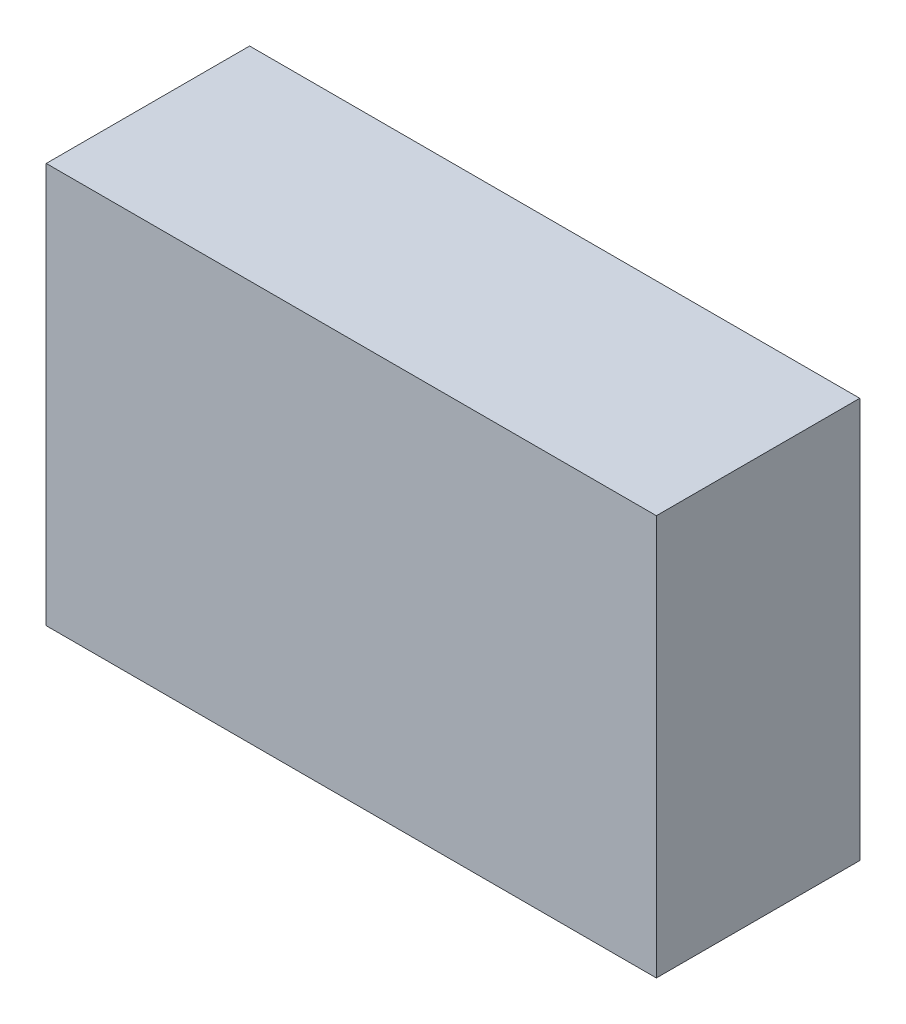
ISO-10303-21;
HEADER;
FILE_DESCRIPTION(('STEP AP214'),'2;1');
FILE_NAME('part.step','',(''),(''),'','','');
FILE_SCHEMA(('AUTOMOTIVE_DESIGN { 1 0 10303 214 1 1 1 1 }'));
ENDSEC;
DATA;
#1=APPLICATION_CONTEXT('core data for automotive mechanical design processes');
#2=APPLICATION_PROTOCOL_DEFINITION('international standard','automotive_design',2000,#1);
#3=PRODUCT_CONTEXT('',#1,'mechanical');
#4=PRODUCT('Part','Part','',(#3));
#5=PRODUCT_RELATED_PRODUCT_CATEGORY('part','',(#4));
#6=PRODUCT_DEFINITION_FORMATION('','',#4);
#7=PRODUCT_DEFINITION_CONTEXT('part definition',#1,'design');
#8=PRODUCT_DEFINITION('design','',#6,#7);
#9=PRODUCT_DEFINITION_SHAPE('','',#8);
#10=(LENGTH_UNIT() NAMED_UNIT(*) SI_UNIT(.MILLI.,.METRE.));
#11=(NAMED_UNIT(*) PLANE_ANGLE_UNIT() SI_UNIT($,.RADIAN.));
#12=(NAMED_UNIT(*) SI_UNIT($,.STERADIAN.) SOLID_ANGLE_UNIT());
#13=UNCERTAINTY_MEASURE_WITH_UNIT(LENGTH_MEASURE(1.E-05),#10,'distance_accuracy_value','');
#14=(GEOMETRIC_REPRESENTATION_CONTEXT(3) GLOBAL_UNCERTAINTY_ASSIGNED_CONTEXT((#13)) GLOBAL_UNIT_ASSIGNED_CONTEXT((#10,
#11,#12)) REPRESENTATION_CONTEXT('',''));
#15=CARTESIAN_POINT('',(0.,0.,0.));
#16=DIRECTION('',(0.,0.,1.));
#17=DIRECTION('',(1.,0.,0.));
#18=AXIS2_PLACEMENT_3D('',#15,#16,#17);
#19=CARTESIAN_POINT('',(3.81,5.,1.27));
#20=DIRECTION('',(-1.,0.,0.));
#21=DIRECTION('',(0.,0.,1.));
#22=AXIS2_PLACEMENT_3D('',#19,#20,#21);
#23=PLANE('',#22);
#24=DIRECTION('',(0.,0.,-1.));
#25=VECTOR('',#24,1.);
#26=CARTESIAN_POINT('',(3.81,0.,1.27));
#27=LINE('',#26,#25);
#28=CARTESIAN_POINT('',(3.81,0.,1.27));
#29=VERTEX_POINT('',#28);
#30=CARTESIAN_POINT('',(3.81,0.,-1.27));
#31=VERTEX_POINT('',#30);
#32=EDGE_CURVE('E100',#29,#31,#27,.T.);
#33=ORIENTED_EDGE('',*,*,#32,.T.);
#34=DIRECTION('',(0.,-1.,0.));
#35=VECTOR('',#34,1.);
#36=CARTESIAN_POINT('',(3.81,5.,-1.27));
#37=LINE('',#36,#35);
#38=CARTESIAN_POINT('',(3.81,5.,-1.27));
#39=VERTEX_POINT('',#38);
#40=EDGE_CURVE('E11',#39,#31,#37,.T.);
#41=ORIENTED_EDGE('',*,*,#40,.F.);
#42=DIRECTION('',(0.,0.,-1.));
#43=VECTOR('',#42,1.);
#44=CARTESIAN_POINT('',(3.81,5.,1.27));
#45=LINE('',#44,#43);
#46=CARTESIAN_POINT('',(3.81,5.,1.27));
#47=VERTEX_POINT('',#46);
#48=EDGE_CURVE('E88',#47,#39,#45,.T.);
#49=ORIENTED_EDGE('',*,*,#48,.F.);
#50=DIRECTION('',(0.,-1.,0.));
#51=VECTOR('',#50,1.);
#52=CARTESIAN_POINT('',(3.81,5.,1.27));
#53=LINE('',#52,#51);
#54=EDGE_CURVE('E96',#47,#29,#53,.T.);
#55=ORIENTED_EDGE('',*,*,#54,.T.);
#56=EDGE_LOOP('',(#33,#41,#49,#55));
#57=FACE_BOUND('',#56,.T.);
#58=ADVANCED_FACE('F37',(#57),#23,.F.);
#59=CARTESIAN_POINT('',(-3.81,5.,-1.27));
#60=DIRECTION('',(0.,0.,1.));
#61=DIRECTION('',(1.,0.,0.));
#62=AXIS2_PLACEMENT_3D('',#59,#60,#61);
#63=PLANE('',#62);
#64=DIRECTION('',(-1.,0.,0.));
#65=VECTOR('',#64,1.);
#66=CARTESIAN_POINT('',(-3.81,0.,-1.27));
#67=LINE('',#66,#65);
#68=CARTESIAN_POINT('',(-3.81,0.,-1.27));
#69=VERTEX_POINT('',#68);
#70=EDGE_CURVE('E92',#31,#69,#67,.T.);
#71=ORIENTED_EDGE('',*,*,#70,.T.);
#72=DIRECTION('',(0.,-1.,0.));
#73=VECTOR('',#72,1.);
#74=CARTESIAN_POINT('',(-3.81,5.,-1.27));
#75=LINE('',#74,#73);
#76=CARTESIAN_POINT('',(-3.81,5.,-1.27));
#77=VERTEX_POINT('',#76);
#78=EDGE_CURVE('E45',#77,#69,#75,.T.);
#79=ORIENTED_EDGE('',*,*,#78,.F.);
#80=DIRECTION('',(-1.,0.,0.));
#81=VECTOR('',#80,1.);
#82=CARTESIAN_POINT('',(-3.81,5.,-1.27));
#83=LINE('',#82,#81);
#84=EDGE_CURVE('E83',#39,#77,#83,.T.);
#85=ORIENTED_EDGE('',*,*,#84,.F.);
#86=ORIENTED_EDGE('',*,*,#40,.T.);
#87=EDGE_LOOP('',(#71,#79,#85,#86));
#88=FACE_BOUND('',#87,.T.);
#89=ADVANCED_FACE('F91',(#88),#63,.F.);
#90=CARTESIAN_POINT('',(-3.81,5.,1.27));
#91=DIRECTION('',(1.,0.,0.));
#92=DIRECTION('',(0.,0.,-1.));
#93=AXIS2_PLACEMENT_3D('',#90,#91,#92);
#94=PLANE('',#93);
#95=DIRECTION('',(0.,0.,1.));
#96=VECTOR('',#95,1.);
#97=CARTESIAN_POINT('',(-3.81,0.,1.27));
#98=LINE('',#97,#96);
#99=CARTESIAN_POINT('',(-3.81,0.,1.27));
#100=VERTEX_POINT('',#99);
#101=EDGE_CURVE('E70',#69,#100,#98,.T.);
#102=ORIENTED_EDGE('',*,*,#101,.T.);
#103=DIRECTION('',(0.,-1.,0.));
#104=VECTOR('',#103,1.);
#105=CARTESIAN_POINT('',(-3.81,5.,1.27));
#106=LINE('',#105,#104);
#107=CARTESIAN_POINT('',(-3.81,5.,1.27));
#108=VERTEX_POINT('',#107);
#109=EDGE_CURVE('E93',#108,#100,#106,.T.);
#110=ORIENTED_EDGE('',*,*,#109,.F.);
#111=DIRECTION('',(0.,0.,1.));
#112=VECTOR('',#111,1.);
#113=CARTESIAN_POINT('',(-3.81,5.,1.27));
#114=LINE('',#113,#112);
#115=EDGE_CURVE('E86',#77,#108,#114,.T.);
#116=ORIENTED_EDGE('',*,*,#115,.F.);
#117=ORIENTED_EDGE('',*,*,#78,.T.);
#118=EDGE_LOOP('',(#102,#110,#116,#117));
#119=FACE_BOUND('',#118,.T.);
#120=ADVANCED_FACE('F94',(#119),#94,.F.);
#121=CARTESIAN_POINT('',(-3.81,5.,1.27));
#122=DIRECTION('',(0.,0.,-1.));
#123=DIRECTION('',(-1.,0.,0.));
#124=AXIS2_PLACEMENT_3D('',#121,#122,#123);
#125=PLANE('',#124);
#126=DIRECTION('',(1.,0.,0.));
#127=VECTOR('',#126,1.);
#128=CARTESIAN_POINT('',(-3.81,0.,1.27));
#129=LINE('',#128,#127);
#130=EDGE_CURVE('E76',#100,#29,#129,.T.);
#131=ORIENTED_EDGE('',*,*,#130,.T.);
#132=ORIENTED_EDGE('',*,*,#54,.F.);
#133=DIRECTION('',(1.,0.,0.));
#134=VECTOR('',#133,1.);
#135=CARTESIAN_POINT('',(-3.81,5.,1.27));
#136=LINE('',#135,#134);
#137=EDGE_CURVE('E53',#108,#47,#136,.T.);
#138=ORIENTED_EDGE('',*,*,#137,.F.);
#139=ORIENTED_EDGE('',*,*,#109,.T.);
#140=EDGE_LOOP('',(#131,#132,#138,#139));
#141=FACE_BOUND('',#140,.T.);
#142=ADVANCED_FACE('F107',(#141),#125,.F.);
#143=CARTESIAN_POINT('',(0.,5.,0.));
#144=DIRECTION('',(0.,-1.,0.));
#145=DIRECTION('',(0.,0.,-1.));
#146=AXIS2_PLACEMENT_3D('',#143,#144,#145);
#147=PLANE('',#146);
#148=ORIENTED_EDGE('',*,*,#48,.T.);
#149=ORIENTED_EDGE('',*,*,#84,.T.);
#150=ORIENTED_EDGE('',*,*,#115,.T.);
#151=ORIENTED_EDGE('',*,*,#137,.T.);
#152=EDGE_LOOP('',(#148,#149,#150,#151));
#153=FACE_BOUND('',#152,.T.);
#154=ADVANCED_FACE('F84',(#153),#147,.F.);
#155=CARTESIAN_POINT('',(0.,0.,0.));
#156=DIRECTION('',(0.,-1.,0.));
#157=DIRECTION('',(0.,0.,-1.));
#158=AXIS2_PLACEMENT_3D('',#155,#156,#157);
#159=PLANE('',#158);
#160=ORIENTED_EDGE('',*,*,#32,.F.);
#161=ORIENTED_EDGE('',*,*,#130,.F.);
#162=ORIENTED_EDGE('',*,*,#101,.F.);
#163=ORIENTED_EDGE('',*,*,#70,.F.);
#164=EDGE_LOOP('',(#160,#161,#162,#163));
#165=FACE_BOUND('',#164,.T.);
#166=ADVANCED_FACE('F110',(#165),#159,.T.);
#167=CLOSED_SHELL('',(#58,#89,#120,#142,#154,#166));
#168=MANIFOLD_SOLID_BREP('B2',#167);
#169=ADVANCED_BREP_SHAPE_REPRESENTATION('',(#18,#168),#14);
#170=SHAPE_DEFINITION_REPRESENTATION(#9,#169);
ENDSEC;
END-ISO-10303-21;
